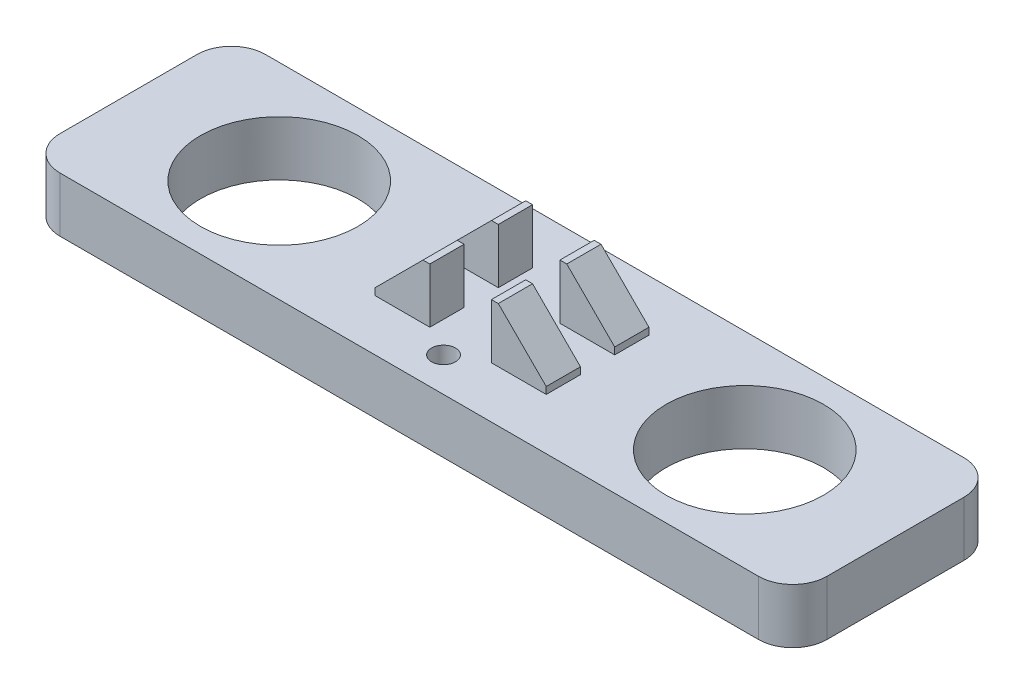
ISO-10303-21;
HEADER;
FILE_DESCRIPTION(('STEP AP214'),'2;1');
FILE_NAME('part.step','',(''),(''),'','','');
FILE_SCHEMA(('AUTOMOTIVE_DESIGN { 1 0 10303 214 1 1 1 1 }'));
ENDSEC;
DATA;
#1=APPLICATION_CONTEXT('core data for automotive mechanical design processes');
#2=APPLICATION_PROTOCOL_DEFINITION('international standard','automotive_design',2000,#1);
#3=PRODUCT_CONTEXT('',#1,'mechanical');
#4=PRODUCT('Part','Part','',(#3));
#5=PRODUCT_RELATED_PRODUCT_CATEGORY('part','',(#4));
#6=PRODUCT_DEFINITION_FORMATION('','',#4);
#7=PRODUCT_DEFINITION_CONTEXT('part definition',#1,'design');
#8=PRODUCT_DEFINITION('design','',#6,#7);
#9=PRODUCT_DEFINITION_SHAPE('','',#8);
#10=(LENGTH_UNIT() NAMED_UNIT(*) SI_UNIT(.MILLI.,.METRE.));
#11=(NAMED_UNIT(*) PLANE_ANGLE_UNIT() SI_UNIT($,.RADIAN.));
#12=(NAMED_UNIT(*) SI_UNIT($,.STERADIAN.) SOLID_ANGLE_UNIT());
#13=UNCERTAINTY_MEASURE_WITH_UNIT(LENGTH_MEASURE(1.E-05),#10,'distance_accuracy_value','');
#14=(GEOMETRIC_REPRESENTATION_CONTEXT(3) GLOBAL_UNCERTAINTY_ASSIGNED_CONTEXT((#13)) GLOBAL_UNIT_ASSIGNED_CONTEXT((#10,
#11,#12)) REPRESENTATION_CONTEXT('',''));
#15=CARTESIAN_POINT('',(0.,0.,0.));
#16=DIRECTION('',(0.,0.,1.));
#17=DIRECTION('',(1.,0.,0.));
#18=AXIS2_PLACEMENT_3D('',#15,#16,#17);
#19=CARTESIAN_POINT('',(0.,5.,0.));
#20=DIRECTION('',(0.,-1.,0.));
#21=DIRECTION('',(0.,0.,-1.));
#22=AXIS2_PLACEMENT_3D('',#19,#20,#21);
#23=PLANE('',#22);
#24=DIRECTION('',(-1.,0.,0.));
#25=VECTOR('',#24,1.);
#26=CARTESIAN_POINT('',(60.5,5.,-7.5));
#27=LINE('',#26,#25);
#28=CARTESIAN_POINT('',(68.5,5.,-7.5));
#29=VERTEX_POINT('',#28);
#30=CARTESIAN_POINT('',(60.5,5.,-7.5));
#31=VERTEX_POINT('',#30);
#32=EDGE_CURVE('E257',#29,#31,#27,.T.);
#33=ORIENTED_EDGE('',*,*,#32,.T.);
#34=DIRECTION('',(0.,0.,-1.));
#35=VECTOR('',#34,1.);
#36=CARTESIAN_POINT('',(60.5,5.,-7.5));
#37=LINE('',#36,#35);
#38=CARTESIAN_POINT('',(60.5,5.,-12.5));
#39=VERTEX_POINT('',#38);
#40=EDGE_CURVE('E241',#31,#39,#37,.T.);
#41=ORIENTED_EDGE('',*,*,#40,.T.);
#42=DIRECTION('',(1.,0.,0.));
#43=VECTOR('',#42,1.);
#44=CARTESIAN_POINT('',(60.5,5.,-12.5));
#45=LINE('',#44,#43);
#46=CARTESIAN_POINT('',(68.5,5.,-12.5));
#47=VERTEX_POINT('',#46);
#48=EDGE_CURVE('E248',#39,#47,#45,.T.);
#49=ORIENTED_EDGE('',*,*,#48,.T.);
#50=DIRECTION('',(0.,0.,1.));
#51=VECTOR('',#50,1.);
#52=CARTESIAN_POINT('',(68.5,5.,-7.5));
#53=LINE('',#52,#51);
#54=EDGE_CURVE('E251',#47,#29,#53,.T.);
#55=ORIENTED_EDGE('',*,*,#54,.T.);
#56=EDGE_LOOP('',(#33,#41,#49,#55));
#57=FACE_BOUND('',#56,.T.);
#58=DIRECTION('',(-1.,0.,0.));
#59=VECTOR('',#58,1.);
#60=CARTESIAN_POINT('',(43.5,5.,-7.5));
#61=LINE('',#60,#59);
#62=CARTESIAN_POINT('',(51.5,5.,-7.5));
#63=VERTEX_POINT('',#62);
#64=CARTESIAN_POINT('',(43.5,5.,-7.5));
#65=VERTEX_POINT('',#64);
#66=EDGE_CURVE('E276',#63,#65,#61,.T.);
#67=ORIENTED_EDGE('',*,*,#66,.T.);
#68=DIRECTION('',(0.,0.,-1.));
#69=VECTOR('',#68,1.);
#70=CARTESIAN_POINT('',(43.5,5.,-7.5));
#71=LINE('',#70,#69);
#72=CARTESIAN_POINT('',(43.5,5.,-12.5));
#73=VERTEX_POINT('',#72);
#74=EDGE_CURVE('E243',#65,#73,#71,.T.);
#75=ORIENTED_EDGE('',*,*,#74,.T.);
#76=DIRECTION('',(1.,0.,0.));
#77=VECTOR('',#76,1.);
#78=CARTESIAN_POINT('',(43.5,5.,-12.5));
#79=LINE('',#78,#77);
#80=CARTESIAN_POINT('',(51.5,5.,-12.5));
#81=VERTEX_POINT('',#80);
#82=EDGE_CURVE('E268',#73,#81,#79,.T.);
#83=ORIENTED_EDGE('',*,*,#82,.T.);
#84=DIRECTION('',(0.,0.,1.));
#85=VECTOR('',#84,1.);
#86=CARTESIAN_POINT('',(51.5,5.,-7.5));
#87=LINE('',#86,#85);
#88=EDGE_CURVE('E279',#81,#63,#87,.T.);
#89=ORIENTED_EDGE('',*,*,#88,.T.);
#90=EDGE_LOOP('',(#67,#75,#83,#89));
#91=FACE_BOUND('',#90,.T.);
#92=DIRECTION('',(0.,0.,1.));
#93=VECTOR('',#92,1.);
#94=CARTESIAN_POINT('',(43.5,5.,-22.5));
#95=LINE('',#94,#93);
#96=CARTESIAN_POINT('',(43.5,5.,-22.5));
#97=VERTEX_POINT('',#96);
#98=CARTESIAN_POINT('',(43.5,5.,-17.5));
#99=VERTEX_POINT('',#98);
#100=EDGE_CURVE('E322',#97,#99,#95,.T.);
#101=ORIENTED_EDGE('',*,*,#100,.F.);
#102=DIRECTION('',(-1.,0.,0.));
#103=VECTOR('',#102,1.);
#104=CARTESIAN_POINT('',(43.5,5.,-22.5));
#105=LINE('',#104,#103);
#106=CARTESIAN_POINT('',(51.5,5.,-22.5));
#107=VERTEX_POINT('',#106);
#108=EDGE_CURVE('E326',#107,#97,#105,.T.);
#109=ORIENTED_EDGE('',*,*,#108,.F.);
#110=DIRECTION('',(0.,0.,-1.));
#111=VECTOR('',#110,1.);
#112=CARTESIAN_POINT('',(51.5,5.,-22.5));
#113=LINE('',#112,#111);
#114=CARTESIAN_POINT('',(51.5,5.,-17.5));
#115=VERTEX_POINT('',#114);
#116=EDGE_CURVE('E337',#115,#107,#113,.T.);
#117=ORIENTED_EDGE('',*,*,#116,.F.);
#118=DIRECTION('',(1.,0.,0.));
#119=VECTOR('',#118,1.);
#120=CARTESIAN_POINT('',(43.5,5.,-17.5));
#121=LINE('',#120,#119);
#122=EDGE_CURVE('E334',#99,#115,#121,.T.);
#123=ORIENTED_EDGE('',*,*,#122,.F.);
#124=EDGE_LOOP('',(#101,#109,#117,#123));
#125=FACE_BOUND('',#124,.T.);
#126=CARTESIAN_POINT('',(56.,5.,-25.));
#127=DIRECTION('',(0.,-1.,0.));
#128=DIRECTION('',(0.,0.,1.));
#129=AXIS2_PLACEMENT_3D('',#126,#127,#128);
#130=CIRCLE('',#129,1.75);
#131=CARTESIAN_POINT('',(56.,5.,-23.25));
#132=VERTEX_POINT('',#131);
#133=EDGE_CURVE('E364',#132,#132,#130,.T.);
#134=ORIENTED_EDGE('',*,*,#133,.T.);
#135=EDGE_LOOP('',(#134));
#136=FACE_BOUND('',#135,.T.);
#137=CARTESIAN_POINT('',(56.,5.,-5.));
#138=DIRECTION('',(0.,-1.,0.));
#139=DIRECTION('',(0.,0.,1.));
#140=AXIS2_PLACEMENT_3D('',#137,#138,#139);
#141=CIRCLE('',#140,1.75);
#142=CARTESIAN_POINT('',(56.,5.,-3.25));
#143=VERTEX_POINT('',#142);
#144=EDGE_CURVE('E363',#143,#143,#141,.T.);
#145=ORIENTED_EDGE('',*,*,#144,.T.);
#146=EDGE_LOOP('',(#145));
#147=FACE_BOUND('',#146,.T.);
#148=DIRECTION('',(1.,0.,0.));
#149=VECTOR('',#148,1.);
#150=CARTESIAN_POINT('',(0.,5.,0.));
#151=LINE('',#150,#149);
#152=CARTESIAN_POINT('',(5.,5.,0.));
#153=VERTEX_POINT('',#152);
#154=CARTESIAN_POINT('',(107.,5.,0.));
#155=VERTEX_POINT('',#154);
#156=EDGE_CURVE('E403',#153,#155,#151,.T.);
#157=ORIENTED_EDGE('',*,*,#156,.T.);
#158=CARTESIAN_POINT('',(107.,5.,-5.));
#159=DIRECTION('',(0.,-1.,0.));
#160=DIRECTION('',(0.,0.,-1.));
#161=AXIS2_PLACEMENT_3D('',#158,#159,#160);
#162=CIRCLE('',#161,5.);
#163=CARTESIAN_POINT('',(112.,5.,-5.));
#164=VERTEX_POINT('',#163);
#165=EDGE_CURVE('E430',#155,#164,#162,.F.);
#166=ORIENTED_EDGE('',*,*,#165,.T.);
#167=DIRECTION('',(0.,0.,1.));
#168=VECTOR('',#167,1.);
#169=CARTESIAN_POINT('',(112.,5.,0.));
#170=LINE('',#169,#168);
#171=CARTESIAN_POINT('',(112.,5.,-25.));
#172=VERTEX_POINT('',#171);
#173=EDGE_CURVE('E372',#172,#164,#170,.T.);
#174=ORIENTED_EDGE('',*,*,#173,.F.);
#175=CARTESIAN_POINT('',(107.,5.,-25.));
#176=DIRECTION('',(0.,-1.,0.));
#177=DIRECTION('',(0.,0.,-1.));
#178=AXIS2_PLACEMENT_3D('',#175,#176,#177);
#179=CIRCLE('',#178,5.);
#180=CARTESIAN_POINT('',(107.,5.,-30.));
#181=VERTEX_POINT('',#180);
#182=EDGE_CURVE('E428',#172,#181,#179,.F.);
#183=ORIENTED_EDGE('',*,*,#182,.T.);
#184=DIRECTION('',(-1.,0.,0.));
#185=VECTOR('',#184,1.);
#186=CARTESIAN_POINT('',(0.,5.,-30.));
#187=LINE('',#186,#185);
#188=CARTESIAN_POINT('',(5.,5.,-30.));
#189=VERTEX_POINT('',#188);
#190=EDGE_CURVE('E406',#181,#189,#187,.T.);
#191=ORIENTED_EDGE('',*,*,#190,.T.);
#192=CARTESIAN_POINT('',(5.,5.,-25.));
#193=DIRECTION('',(0.,-1.,0.));
#194=DIRECTION('',(0.,0.,-1.));
#195=AXIS2_PLACEMENT_3D('',#192,#193,#194);
#196=CIRCLE('',#195,5.);
#197=CARTESIAN_POINT('',(0.,5.,-25.));
#198=VERTEX_POINT('',#197);
#199=EDGE_CURVE('E415',#189,#198,#196,.F.);
#200=ORIENTED_EDGE('',*,*,#199,.T.);
#201=DIRECTION('',(0.,0.,1.));
#202=VECTOR('',#201,1.);
#203=CARTESIAN_POINT('',(0.,5.,0.));
#204=LINE('',#203,#202);
#205=CARTESIAN_POINT('',(0.,5.,-5.));
#206=VERTEX_POINT('',#205);
#207=EDGE_CURVE('E400',#198,#206,#204,.T.);
#208=ORIENTED_EDGE('',*,*,#207,.T.);
#209=CARTESIAN_POINT('',(5.,5.,-5.));
#210=DIRECTION('',(0.,-1.,0.));
#211=DIRECTION('',(0.,0.,-1.));
#212=AXIS2_PLACEMENT_3D('',#209,#210,#211);
#213=CIRCLE('',#212,5.);
#214=EDGE_CURVE('E417',#206,#153,#213,.F.);
#215=ORIENTED_EDGE('',*,*,#214,.T.);
#216=EDGE_LOOP('',(#157,#166,#174,#183,#191,#200,#208,#215));
#217=FACE_BOUND('',#216,.T.);
#218=CARTESIAN_POINT('',(22.,5.,-15.));
#219=DIRECTION('',(0.,1.,0.));
#220=DIRECTION('',(0.,0.,1.));
#221=AXIS2_PLACEMENT_3D('',#218,#219,#220);
#222=CIRCLE('',#221,11.5);
#223=CARTESIAN_POINT('',(22.,5.,-3.5));
#224=VERTEX_POINT('',#223);
#225=EDGE_CURVE('E397',#224,#224,#222,.T.);
#226=ORIENTED_EDGE('',*,*,#225,.F.);
#227=EDGE_LOOP('',(#226));
#228=FACE_BOUND('',#227,.T.);
#229=CARTESIAN_POINT('',(90.,5.,-15.));
#230=DIRECTION('',(0.,-1.,0.));
#231=DIRECTION('',(0.,0.,1.));
#232=AXIS2_PLACEMENT_3D('',#229,#230,#231);
#233=CIRCLE('',#232,11.5);
#234=CARTESIAN_POINT('',(90.,5.,-3.5));
#235=VERTEX_POINT('',#234);
#236=EDGE_CURVE('E367',#235,#235,#233,.T.);
#237=ORIENTED_EDGE('',*,*,#236,.T.);
#238=EDGE_LOOP('',(#237));
#239=FACE_BOUND('',#238,.T.);
#240=DIRECTION('',(0.,0.,1.));
#241=VECTOR('',#240,1.);
#242=CARTESIAN_POINT('',(60.5,5.,-22.5));
#243=LINE('',#242,#241);
#244=CARTESIAN_POINT('',(60.5,5.,-22.5));
#245=VERTEX_POINT('',#244);
#246=CARTESIAN_POINT('',(60.5,5.,-17.5));
#247=VERTEX_POINT('',#246);
#248=EDGE_CURVE('E292',#245,#247,#243,.T.);
#249=ORIENTED_EDGE('',*,*,#248,.F.);
#250=DIRECTION('',(-1.,0.,0.));
#251=VECTOR('',#250,1.);
#252=CARTESIAN_POINT('',(60.5,5.,-22.5));
#253=LINE('',#252,#251);
#254=CARTESIAN_POINT('',(68.5,5.,-22.5));
#255=VERTEX_POINT('',#254);
#256=EDGE_CURVE('E297',#255,#245,#253,.T.);
#257=ORIENTED_EDGE('',*,*,#256,.F.);
#258=DIRECTION('',(0.,0.,-1.));
#259=VECTOR('',#258,1.);
#260=CARTESIAN_POINT('',(68.5,5.,-22.5));
#261=LINE('',#260,#259);
#262=CARTESIAN_POINT('',(68.5,5.,-17.5));
#263=VERTEX_POINT('',#262);
#264=EDGE_CURVE('E308',#263,#255,#261,.T.);
#265=ORIENTED_EDGE('',*,*,#264,.F.);
#266=DIRECTION('',(1.,0.,0.));
#267=VECTOR('',#266,1.);
#268=CARTESIAN_POINT('',(60.5,5.,-17.5));
#269=LINE('',#268,#267);
#270=EDGE_CURVE('E305',#247,#263,#269,.T.);
#271=ORIENTED_EDGE('',*,*,#270,.F.);
#272=EDGE_LOOP('',(#249,#257,#265,#271));
#273=FACE_BOUND('',#272,.T.);
#274=ADVANCED_FACE('F38',(#57,#91,#125,#136,#147,#217,#228,#239,#273),#23,.F.);
#275=CARTESIAN_POINT('',(0.,5.,0.));
#276=DIRECTION('',(1.,0.,0.));
#277=DIRECTION('',(0.,0.,-1.));
#278=AXIS2_PLACEMENT_3D('',#275,#276,#277);
#279=PLANE('',#278);
#280=DIRECTION('',(0.,-1.,0.));
#281=VECTOR('',#280,1.);
#282=CARTESIAN_POINT('',(0.,5.,-25.));
#283=LINE('',#282,#281);
#284=CARTESIAN_POINT('',(0.,-3.,-25.));
#285=VERTEX_POINT('',#284);
#286=EDGE_CURVE('E411',#198,#285,#283,.T.);
#287=ORIENTED_EDGE('',*,*,#286,.T.);
#288=DIRECTION('',(0.,0.,-1.));
#289=VECTOR('',#288,1.);
#290=CARTESIAN_POINT('',(0.,-3.,0.));
#291=LINE('',#290,#289);
#292=CARTESIAN_POINT('',(0.,-3.,-5.));
#293=VERTEX_POINT('',#292);
#294=EDGE_CURVE('E386',#293,#285,#291,.T.);
#295=ORIENTED_EDGE('',*,*,#294,.F.);
#296=DIRECTION('',(0.,-1.,0.));
#297=VECTOR('',#296,1.);
#298=CARTESIAN_POINT('',(0.,5.,-5.));
#299=LINE('',#298,#297);
#300=EDGE_CURVE('E413',#293,#206,#299,.F.);
#301=ORIENTED_EDGE('',*,*,#300,.T.);
#302=ORIENTED_EDGE('',*,*,#207,.F.);
#303=EDGE_LOOP('',(#287,#295,#301,#302));
#304=FACE_BOUND('',#303,.T.);
#305=ADVANCED_FACE('F486',(#304),#279,.F.);
#306=CARTESIAN_POINT('',(0.,5.,0.));
#307=DIRECTION('',(0.,0.,-1.));
#308=DIRECTION('',(-1.,0.,0.));
#309=AXIS2_PLACEMENT_3D('',#306,#307,#308);
#310=PLANE('',#309);
#311=DIRECTION('',(0.,-1.,0.));
#312=VECTOR('',#311,1.);
#313=CARTESIAN_POINT('',(5.,5.,0.));
#314=LINE('',#313,#312);
#315=CARTESIAN_POINT('',(5.,-3.,0.));
#316=VERTEX_POINT('',#315);
#317=EDGE_CURVE('E408',#153,#316,#314,.T.);
#318=ORIENTED_EDGE('',*,*,#317,.T.);
#319=DIRECTION('',(-1.,0.,0.));
#320=VECTOR('',#319,1.);
#321=CARTESIAN_POINT('',(0.,-3.,0.));
#322=LINE('',#321,#320);
#323=CARTESIAN_POINT('',(107.,-3.,0.));
#324=VERTEX_POINT('',#323);
#325=EDGE_CURVE('E381',#324,#316,#322,.T.);
#326=ORIENTED_EDGE('',*,*,#325,.F.);
#327=DIRECTION('',(0.,-1.,0.));
#328=VECTOR('',#327,1.);
#329=CARTESIAN_POINT('',(107.,5.,0.));
#330=LINE('',#329,#328);
#331=EDGE_CURVE('E426',#324,#155,#330,.F.);
#332=ORIENTED_EDGE('',*,*,#331,.T.);
#333=ORIENTED_EDGE('',*,*,#156,.F.);
#334=EDGE_LOOP('',(#318,#326,#332,#333));
#335=FACE_BOUND('',#334,.T.);
#336=ADVANCED_FACE('F492',(#335),#310,.F.);
#337=CARTESIAN_POINT('',(0.,5.,-30.));
#338=DIRECTION('',(0.,0.,1.));
#339=DIRECTION('',(1.,0.,0.));
#340=AXIS2_PLACEMENT_3D('',#337,#338,#339);
#341=PLANE('',#340);
#342=DIRECTION('',(0.,-1.,0.));
#343=VECTOR('',#342,1.);
#344=CARTESIAN_POINT('',(107.,0.,-30.));
#345=LINE('',#344,#343);
#346=CARTESIAN_POINT('',(107.,-3.,-30.));
#347=VERTEX_POINT('',#346);
#348=EDGE_CURVE('E432',#181,#347,#345,.T.);
#349=ORIENTED_EDGE('',*,*,#348,.T.);
#350=DIRECTION('',(1.,0.,0.));
#351=VECTOR('',#350,1.);
#352=CARTESIAN_POINT('',(0.,-3.,-30.));
#353=LINE('',#352,#351);
#354=CARTESIAN_POINT('',(5.,-3.,-30.));
#355=VERTEX_POINT('',#354);
#356=EDGE_CURVE('E392',#355,#347,#353,.T.);
#357=ORIENTED_EDGE('',*,*,#356,.F.);
#358=DIRECTION('',(0.,-1.,0.));
#359=VECTOR('',#358,1.);
#360=CARTESIAN_POINT('',(5.,5.,-30.));
#361=LINE('',#360,#359);
#362=EDGE_CURVE('E419',#355,#189,#361,.F.);
#363=ORIENTED_EDGE('',*,*,#362,.T.);
#364=ORIENTED_EDGE('',*,*,#190,.F.);
#365=EDGE_LOOP('',(#349,#357,#363,#364));
#366=FACE_BOUND('',#365,.T.);
#367=ADVANCED_FACE('F499',(#366),#341,.F.);
#368=CARTESIAN_POINT('',(22.,5.,-15.));
#369=DIRECTION('',(0.,-1.,0.));
#370=DIRECTION('',(0.,0.,-1.));
#371=AXIS2_PLACEMENT_3D('',#368,#369,#370);
#372=CYLINDRICAL_SURFACE('',#371,11.5);
#373=ORIENTED_EDGE('',*,*,#225,.T.);
#374=EDGE_LOOP('',(#373));
#375=FACE_BOUND('',#374,.T.);
#376=CARTESIAN_POINT('',(22.,-3.,-15.));
#377=DIRECTION('',(0.,-1.,0.));
#378=DIRECTION('',(0.,0.,-1.));
#379=AXIS2_PLACEMENT_3D('',#376,#377,#378);
#380=CIRCLE('',#379,11.5);
#381=CARTESIAN_POINT('',(22.,-3.,-26.5));
#382=VERTEX_POINT('',#381);
#383=EDGE_CURVE('E378',#382,#382,#380,.F.);
#384=ORIENTED_EDGE('',*,*,#383,.F.);
#385=EDGE_LOOP('',(#384));
#386=FACE_BOUND('',#385,.T.);
#387=ADVANCED_FACE('F497',(#375,#386),#372,.F.);
#388=CARTESIAN_POINT('',(56.,0.,-5.));
#389=DIRECTION('',(0.,1.,0.));
#390=DIRECTION('',(0.,0.,1.));
#391=AXIS2_PLACEMENT_3D('',#388,#389,#390);
#392=CYLINDRICAL_SURFACE('',#391,1.75);
#393=CARTESIAN_POINT('',(56.,-3.,-5.));
#394=DIRECTION('',(0.,-1.,0.));
#395=DIRECTION('',(0.,0.,-1.));
#396=AXIS2_PLACEMENT_3D('',#393,#394,#395);
#397=CIRCLE('',#396,1.75);
#398=CARTESIAN_POINT('',(56.,-3.,-6.75));
#399=VERTEX_POINT('',#398);
#400=EDGE_CURVE('E375',#399,#399,#397,.F.);
#401=ORIENTED_EDGE('',*,*,#400,.F.);
#402=EDGE_LOOP('',(#401));
#403=FACE_BOUND('',#402,.T.);
#404=ORIENTED_EDGE('',*,*,#144,.F.);
#405=EDGE_LOOP('',(#404));
#406=FACE_BOUND('',#405,.T.);
#407=ADVANCED_FACE('F592',(#403,#406),#392,.F.);
#408=CARTESIAN_POINT('',(56.,0.,-25.));
#409=DIRECTION('',(0.,1.,0.));
#410=DIRECTION('',(0.,0.,1.));
#411=AXIS2_PLACEMENT_3D('',#408,#409,#410);
#412=CYLINDRICAL_SURFACE('',#411,1.75);
#413=CARTESIAN_POINT('',(56.,-3.,-25.));
#414=DIRECTION('',(0.,-1.,0.));
#415=DIRECTION('',(0.,0.,-1.));
#416=AXIS2_PLACEMENT_3D('',#413,#414,#415);
#417=CIRCLE('',#416,1.75);
#418=CARTESIAN_POINT('',(56.,-3.,-26.75));
#419=VERTEX_POINT('',#418);
#420=EDGE_CURVE('E394',#419,#419,#417,.F.);
#421=ORIENTED_EDGE('',*,*,#420,.F.);
#422=EDGE_LOOP('',(#421));
#423=FACE_BOUND('',#422,.T.);
#424=ORIENTED_EDGE('',*,*,#133,.F.);
#425=EDGE_LOOP('',(#424));
#426=FACE_BOUND('',#425,.T.);
#427=ADVANCED_FACE('F510',(#423,#426),#412,.F.);
#428=CARTESIAN_POINT('',(5.,5.,-5.));
#429=DIRECTION('',(0.,-1.,0.));
#430=DIRECTION('',(0.,0.,-1.));
#431=AXIS2_PLACEMENT_3D('',#428,#429,#430);
#432=CYLINDRICAL_SURFACE('',#431,5.);
#433=ORIENTED_EDGE('',*,*,#214,.F.);
#434=ORIENTED_EDGE('',*,*,#300,.F.);
#435=CARTESIAN_POINT('',(5.,-3.,-5.));
#436=DIRECTION('',(0.,-1.,0.));
#437=DIRECTION('',(0.,0.,-1.));
#438=AXIS2_PLACEMENT_3D('',#435,#436,#437);
#439=CIRCLE('',#438,5.);
#440=EDGE_CURVE('E383',#316,#293,#439,.T.);
#441=ORIENTED_EDGE('',*,*,#440,.F.);
#442=ORIENTED_EDGE('',*,*,#317,.F.);
#443=EDGE_LOOP('',(#433,#434,#441,#442));
#444=FACE_BOUND('',#443,.T.);
#445=ADVANCED_FACE('F506',(#444),#432,.T.);
#446=CARTESIAN_POINT('',(5.,5.,-25.));
#447=DIRECTION('',(0.,-1.,0.));
#448=DIRECTION('',(0.,0.,-1.));
#449=AXIS2_PLACEMENT_3D('',#446,#447,#448);
#450=CYLINDRICAL_SURFACE('',#449,5.);
#451=ORIENTED_EDGE('',*,*,#199,.F.);
#452=ORIENTED_EDGE('',*,*,#362,.F.);
#453=CARTESIAN_POINT('',(5.,-3.,-25.));
#454=DIRECTION('',(0.,-1.,0.));
#455=DIRECTION('',(0.,0.,-1.));
#456=AXIS2_PLACEMENT_3D('',#453,#454,#455);
#457=CIRCLE('',#456,5.);
#458=EDGE_CURVE('E389',#285,#355,#457,.T.);
#459=ORIENTED_EDGE('',*,*,#458,.F.);
#460=ORIENTED_EDGE('',*,*,#286,.F.);
#461=EDGE_LOOP('',(#451,#452,#459,#460));
#462=FACE_BOUND('',#461,.T.);
#463=ADVANCED_FACE('F509',(#462),#450,.T.);
#464=CARTESIAN_POINT('',(0.,-3.,0.));
#465=DIRECTION('',(0.,-1.,0.));
#466=DIRECTION('',(0.,0.,-1.));
#467=AXIS2_PLACEMENT_3D('',#464,#465,#466);
#468=PLANE('',#467);
#469=ORIENTED_EDGE('',*,*,#356,.T.);
#470=CARTESIAN_POINT('',(107.,-3.,-25.));
#471=DIRECTION('',(0.,1.,0.));
#472=DIRECTION('',(0.,0.,-1.));
#473=AXIS2_PLACEMENT_3D('',#470,#471,#472);
#474=CIRCLE('',#473,5.);
#475=CARTESIAN_POINT('',(112.,-3.,-25.));
#476=VERTEX_POINT('',#475);
#477=EDGE_CURVE('E354',#476,#347,#474,.T.);
#478=ORIENTED_EDGE('',*,*,#477,.F.);
#479=DIRECTION('',(0.,0.,-1.));
#480=VECTOR('',#479,1.);
#481=CARTESIAN_POINT('',(112.,-3.,0.));
#482=LINE('',#481,#480);
#483=CARTESIAN_POINT('',(112.,-3.,-5.));
#484=VERTEX_POINT('',#483);
#485=EDGE_CURVE('E357',#484,#476,#482,.T.);
#486=ORIENTED_EDGE('',*,*,#485,.F.);
#487=CARTESIAN_POINT('',(107.,-3.,-5.));
#488=DIRECTION('',(0.,1.,0.));
#489=DIRECTION('',(0.,0.,-1.));
#490=AXIS2_PLACEMENT_3D('',#487,#488,#489);
#491=CIRCLE('',#490,5.);
#492=EDGE_CURVE('E360',#324,#484,#491,.T.);
#493=ORIENTED_EDGE('',*,*,#492,.F.);
#494=ORIENTED_EDGE('',*,*,#325,.T.);
#495=ORIENTED_EDGE('',*,*,#440,.T.);
#496=ORIENTED_EDGE('',*,*,#294,.T.);
#497=ORIENTED_EDGE('',*,*,#458,.T.);
#498=EDGE_LOOP('',(#469,#478,#486,#493,#494,#495,#496,#497));
#499=FACE_BOUND('',#498,.T.);
#500=ORIENTED_EDGE('',*,*,#383,.T.);
#501=EDGE_LOOP('',(#500));
#502=FACE_BOUND('',#501,.T.);
#503=ORIENTED_EDGE('',*,*,#420,.T.);
#504=EDGE_LOOP('',(#503));
#505=FACE_BOUND('',#504,.T.);
#506=ORIENTED_EDGE('',*,*,#400,.T.);
#507=EDGE_LOOP('',(#506));
#508=FACE_BOUND('',#507,.T.);
#509=CARTESIAN_POINT('',(90.,-3.,-15.));
#510=DIRECTION('',(0.,1.,0.));
#511=DIRECTION('',(0.,0.,-1.));
#512=AXIS2_PLACEMENT_3D('',#509,#510,#511);
#513=CIRCLE('',#512,11.5);
#514=CARTESIAN_POINT('',(90.,-3.,-26.5));
#515=VERTEX_POINT('',#514);
#516=EDGE_CURVE('E351',#515,#515,#513,.F.);
#517=ORIENTED_EDGE('',*,*,#516,.F.);
#518=EDGE_LOOP('',(#517));
#519=FACE_BOUND('',#518,.T.);
#520=ADVANCED_FACE('F514',(#499,#502,#505,#508,#519),#468,.T.);
#521=CARTESIAN_POINT('',(112.,5.,0.));
#522=DIRECTION('',(1.,0.,0.));
#523=DIRECTION('',(0.,0.,-1.));
#524=AXIS2_PLACEMENT_3D('',#521,#522,#523);
#525=PLANE('',#524);
#526=ORIENTED_EDGE('',*,*,#173,.T.);
#527=DIRECTION('',(0.,-1.,0.));
#528=VECTOR('',#527,1.);
#529=CARTESIAN_POINT('',(112.,0.,-5.));
#530=LINE('',#529,#528);
#531=EDGE_CURVE('E424',#164,#484,#530,.T.);
#532=ORIENTED_EDGE('',*,*,#531,.T.);
#533=ORIENTED_EDGE('',*,*,#485,.T.);
#534=DIRECTION('',(0.,-1.,0.));
#535=VECTOR('',#534,1.);
#536=CARTESIAN_POINT('',(112.,5.,-25.));
#537=LINE('',#536,#535);
#538=EDGE_CURVE('E422',#476,#172,#537,.F.);
#539=ORIENTED_EDGE('',*,*,#538,.T.);
#540=EDGE_LOOP('',(#526,#532,#533,#539));
#541=FACE_BOUND('',#540,.T.);
#542=ADVANCED_FACE('F583',(#541),#525,.T.);
#543=CARTESIAN_POINT('',(90.,5.,-15.));
#544=DIRECTION('',(0.,-1.,0.));
#545=DIRECTION('',(0.,0.,-1.));
#546=AXIS2_PLACEMENT_3D('',#543,#544,#545);
#547=CYLINDRICAL_SURFACE('',#546,11.5);
#548=ORIENTED_EDGE('',*,*,#236,.F.);
#549=EDGE_LOOP('',(#548));
#550=FACE_BOUND('',#549,.T.);
#551=ORIENTED_EDGE('',*,*,#516,.T.);
#552=EDGE_LOOP('',(#551));
#553=FACE_BOUND('',#552,.T.);
#554=ADVANCED_FACE('F520',(#550,#553),#547,.F.);
#555=CARTESIAN_POINT('',(107.,5.,-5.));
#556=DIRECTION('',(0.,1.,0.));
#557=DIRECTION('',(0.,0.,1.));
#558=AXIS2_PLACEMENT_3D('',#555,#556,#557);
#559=CYLINDRICAL_SURFACE('',#558,5.);
#560=ORIENTED_EDGE('',*,*,#165,.F.);
#561=ORIENTED_EDGE('',*,*,#331,.F.);
#562=ORIENTED_EDGE('',*,*,#492,.T.);
#563=ORIENTED_EDGE('',*,*,#531,.F.);
#564=EDGE_LOOP('',(#560,#561,#562,#563));
#565=FACE_BOUND('',#564,.T.);
#566=ADVANCED_FACE('F516',(#565),#559,.T.);
#567=CARTESIAN_POINT('',(107.,5.,-25.));
#568=DIRECTION('',(0.,1.,0.));
#569=DIRECTION('',(0.,0.,1.));
#570=AXIS2_PLACEMENT_3D('',#567,#568,#569);
#571=CYLINDRICAL_SURFACE('',#570,5.);
#572=ORIENTED_EDGE('',*,*,#182,.F.);
#573=ORIENTED_EDGE('',*,*,#538,.F.);
#574=ORIENTED_EDGE('',*,*,#477,.T.);
#575=ORIENTED_EDGE('',*,*,#348,.F.);
#576=EDGE_LOOP('',(#572,#573,#574,#575));
#577=FACE_BOUND('',#576,.T.);
#578=ADVANCED_FACE('F519',(#577),#571,.T.);
#579=CARTESIAN_POINT('',(43.5,13.,-22.5));
#580=DIRECTION('',(1.,0.,0.));
#581=DIRECTION('',(0.,0.,-1.));
#582=AXIS2_PLACEMENT_3D('',#579,#580,#581);
#583=PLANE('',#582);
#584=DIRECTION('',(0.,-1.,0.));
#585=VECTOR('',#584,1.);
#586=CARTESIAN_POINT('',(43.5,13.,-17.5));
#587=LINE('',#586,#585);
#588=CARTESIAN_POINT('',(43.5,5.99999999999999,-17.5));
#589=VERTEX_POINT('',#588);
#590=EDGE_CURVE('E349',#589,#99,#587,.T.);
#591=ORIENTED_EDGE('',*,*,#590,.F.);
#592=DIRECTION('',(0.,0.,-1.));
#593=VECTOR('',#592,1.);
#594=CARTESIAN_POINT('',(43.5,5.99999999999999,-22.5));
#595=LINE('',#594,#593);
#596=CARTESIAN_POINT('',(43.5,5.99999999999999,-22.5));
#597=VERTEX_POINT('',#596);
#598=EDGE_CURVE('E449',#589,#597,#595,.T.);
#599=ORIENTED_EDGE('',*,*,#598,.T.);
#600=DIRECTION('',(0.,-1.,0.));
#601=VECTOR('',#600,1.);
#602=CARTESIAN_POINT('',(43.5,13.,-22.5));
#603=LINE('',#602,#601);
#604=EDGE_CURVE('E331',#597,#97,#603,.T.);
#605=ORIENTED_EDGE('',*,*,#604,.T.);
#606=ORIENTED_EDGE('',*,*,#100,.T.);
#607=EDGE_LOOP('',(#591,#599,#605,#606));
#608=FACE_BOUND('',#607,.T.);
#609=ADVANCED_FACE('F524',(#608),#583,.F.);
#610=CARTESIAN_POINT('',(43.5,13.,-17.5));
#611=DIRECTION('',(0.,0.,-1.));
#612=DIRECTION('',(-1.,0.,0.));
#613=AXIS2_PLACEMENT_3D('',#610,#611,#612);
#614=PLANE('',#613);
#615=DIRECTION('',(1.,0.,0.));
#616=VECTOR('',#615,1.);
#617=CARTESIAN_POINT('',(43.5,13.,-17.5));
#618=LINE('',#617,#616);
#619=CARTESIAN_POINT('',(50.5,13.,-17.5));
#620=VERTEX_POINT('',#619);
#621=CARTESIAN_POINT('',(51.5,13.,-17.5));
#622=VERTEX_POINT('',#621);
#623=EDGE_CURVE('E323',#620,#622,#618,.T.);
#624=ORIENTED_EDGE('',*,*,#623,.F.);
#625=DIRECTION('',(-0.707106781186546,-0.707106781186549,0.));
#626=VECTOR('',#625,1.);
#627=CARTESIAN_POINT('',(50.5,13.,-17.5));
#628=LINE('',#627,#626);
#629=EDGE_CURVE('E447',#620,#589,#628,.T.);
#630=ORIENTED_EDGE('',*,*,#629,.T.);
#631=ORIENTED_EDGE('',*,*,#590,.T.);
#632=ORIENTED_EDGE('',*,*,#122,.T.);
#633=DIRECTION('',(0.,-1.,0.));
#634=VECTOR('',#633,1.);
#635=CARTESIAN_POINT('',(51.5,13.,-17.5));
#636=LINE('',#635,#634);
#637=EDGE_CURVE('E346',#622,#115,#636,.T.);
#638=ORIENTED_EDGE('',*,*,#637,.F.);
#639=EDGE_LOOP('',(#624,#630,#631,#632,#638));
#640=FACE_BOUND('',#639,.T.);
#641=ADVANCED_FACE('F570',(#640),#614,.F.);
#642=CARTESIAN_POINT('',(51.5,13.,-22.5));
#643=DIRECTION('',(-1.,0.,0.));
#644=DIRECTION('',(0.,0.,1.));
#645=AXIS2_PLACEMENT_3D('',#642,#643,#644);
#646=PLANE('',#645);
#647=ORIENTED_EDGE('',*,*,#116,.T.);
#648=DIRECTION('',(0.,-1.,0.));
#649=VECTOR('',#648,1.);
#650=CARTESIAN_POINT('',(51.5,13.,-22.5));
#651=LINE('',#650,#649);
#652=CARTESIAN_POINT('',(51.5,13.,-22.5));
#653=VERTEX_POINT('',#652);
#654=EDGE_CURVE('E343',#653,#107,#651,.T.);
#655=ORIENTED_EDGE('',*,*,#654,.F.);
#656=DIRECTION('',(0.,0.,-1.));
#657=VECTOR('',#656,1.);
#658=CARTESIAN_POINT('',(51.5,13.,-22.5));
#659=LINE('',#658,#657);
#660=EDGE_CURVE('E325',#622,#653,#659,.T.);
#661=ORIENTED_EDGE('',*,*,#660,.F.);
#662=ORIENTED_EDGE('',*,*,#637,.T.);
#663=EDGE_LOOP('',(#647,#655,#661,#662));
#664=FACE_BOUND('',#663,.T.);
#665=ADVANCED_FACE('F563',(#664),#646,.F.);
#666=CARTESIAN_POINT('',(43.5,13.,-22.5));
#667=DIRECTION('',(0.,0.,1.));
#668=DIRECTION('',(1.,0.,0.));
#669=AXIS2_PLACEMENT_3D('',#666,#667,#668);
#670=PLANE('',#669);
#671=ORIENTED_EDGE('',*,*,#604,.F.);
#672=DIRECTION('',(0.707106781186546,0.707106781186549,0.));
#673=VECTOR('',#672,1.);
#674=CARTESIAN_POINT('',(50.5,13.,-22.5));
#675=LINE('',#674,#673);
#676=CARTESIAN_POINT('',(50.5,13.,-22.5));
#677=VERTEX_POINT('',#676);
#678=EDGE_CURVE('E451',#597,#677,#675,.T.);
#679=ORIENTED_EDGE('',*,*,#678,.T.);
#680=DIRECTION('',(-1.,0.,0.));
#681=VECTOR('',#680,1.);
#682=CARTESIAN_POINT('',(43.5,13.,-22.5));
#683=LINE('',#682,#681);
#684=EDGE_CURVE('E328',#653,#677,#683,.T.);
#685=ORIENTED_EDGE('',*,*,#684,.F.);
#686=ORIENTED_EDGE('',*,*,#654,.T.);
#687=ORIENTED_EDGE('',*,*,#108,.T.);
#688=EDGE_LOOP('',(#671,#679,#685,#686,#687));
#689=FACE_BOUND('',#688,.T.);
#690=ADVANCED_FACE('F555',(#689),#670,.F.);
#691=CARTESIAN_POINT('',(0.,13.,0.));
#692=DIRECTION('',(0.,1.,0.));
#693=DIRECTION('',(0.,0.,1.));
#694=AXIS2_PLACEMENT_3D('',#691,#692,#693);
#695=PLANE('',#694);
#696=ORIENTED_EDGE('',*,*,#684,.T.);
#697=DIRECTION('',(0.,0.,1.));
#698=VECTOR('',#697,1.);
#699=CARTESIAN_POINT('',(50.5,13.,-17.5));
#700=LINE('',#699,#698);
#701=EDGE_CURVE('E444',#677,#620,#700,.T.);
#702=ORIENTED_EDGE('',*,*,#701,.T.);
#703=ORIENTED_EDGE('',*,*,#623,.T.);
#704=ORIENTED_EDGE('',*,*,#660,.T.);
#705=EDGE_LOOP('',(#696,#702,#703,#704));
#706=FACE_BOUND('',#705,.T.);
#707=ADVANCED_FACE('F557',(#706),#695,.T.);
#708=CARTESIAN_POINT('',(60.5,13.,-22.5));
#709=DIRECTION('',(1.,0.,0.));
#710=DIRECTION('',(0.,0.,-1.));
#711=AXIS2_PLACEMENT_3D('',#708,#709,#710);
#712=PLANE('',#711);
#713=ORIENTED_EDGE('',*,*,#248,.T.);
#714=DIRECTION('',(0.,-1.,0.));
#715=VECTOR('',#714,1.);
#716=CARTESIAN_POINT('',(60.5,13.,-17.5));
#717=LINE('',#716,#715);
#718=CARTESIAN_POINT('',(60.5,13.,-17.5));
#719=VERTEX_POINT('',#718);
#720=EDGE_CURVE('E319',#719,#247,#717,.T.);
#721=ORIENTED_EDGE('',*,*,#720,.F.);
#722=DIRECTION('',(0.,0.,1.));
#723=VECTOR('',#722,1.);
#724=CARTESIAN_POINT('',(60.5,13.,-22.5));
#725=LINE('',#724,#723);
#726=CARTESIAN_POINT('',(60.5,13.,-22.5));
#727=VERTEX_POINT('',#726);
#728=EDGE_CURVE('E293',#727,#719,#725,.T.);
#729=ORIENTED_EDGE('',*,*,#728,.F.);
#730=DIRECTION('',(0.,-1.,0.));
#731=VECTOR('',#730,1.);
#732=CARTESIAN_POINT('',(60.5,13.,-22.5));
#733=LINE('',#732,#731);
#734=EDGE_CURVE('E302',#727,#245,#733,.T.);
#735=ORIENTED_EDGE('',*,*,#734,.T.);
#736=EDGE_LOOP('',(#713,#721,#729,#735));
#737=FACE_BOUND('',#736,.T.);
#738=ADVANCED_FACE('F622',(#737),#712,.F.);
#739=CARTESIAN_POINT('',(60.5,13.,-17.5));
#740=DIRECTION('',(0.,0.,-1.));
#741=DIRECTION('',(-1.,0.,0.));
#742=AXIS2_PLACEMENT_3D('',#739,#740,#741);
#743=PLANE('',#742);
#744=DIRECTION('',(0.,-1.,0.));
#745=VECTOR('',#744,1.);
#746=CARTESIAN_POINT('',(68.5,13.,-17.5));
#747=LINE('',#746,#745);
#748=CARTESIAN_POINT('',(68.5,5.99999999999999,-17.5));
#749=VERTEX_POINT('',#748);
#750=EDGE_CURVE('E317',#749,#263,#747,.T.);
#751=ORIENTED_EDGE('',*,*,#750,.F.);
#752=DIRECTION('',(-0.707106781186546,0.707106781186549,0.));
#753=VECTOR('',#752,1.);
#754=CARTESIAN_POINT('',(61.5,13.,-17.5));
#755=LINE('',#754,#753);
#756=CARTESIAN_POINT('',(61.5,13.,-17.5));
#757=VERTEX_POINT('',#756);
#758=EDGE_CURVE('E442',#749,#757,#755,.T.);
#759=ORIENTED_EDGE('',*,*,#758,.T.);
#760=DIRECTION('',(1.,0.,0.));
#761=VECTOR('',#760,1.);
#762=CARTESIAN_POINT('',(60.5,13.,-17.5));
#763=LINE('',#762,#761);
#764=EDGE_CURVE('E296',#719,#757,#763,.T.);
#765=ORIENTED_EDGE('',*,*,#764,.F.);
#766=ORIENTED_EDGE('',*,*,#720,.T.);
#767=ORIENTED_EDGE('',*,*,#270,.T.);
#768=EDGE_LOOP('',(#751,#759,#765,#766,#767));
#769=FACE_BOUND('',#768,.T.);
#770=ADVANCED_FACE('F631',(#769),#743,.F.);
#771=CARTESIAN_POINT('',(68.5,13.,-22.5));
#772=DIRECTION('',(-1.,0.,0.));
#773=DIRECTION('',(0.,0.,1.));
#774=AXIS2_PLACEMENT_3D('',#771,#772,#773);
#775=PLANE('',#774);
#776=DIRECTION('',(0.,-1.,0.));
#777=VECTOR('',#776,1.);
#778=CARTESIAN_POINT('',(68.5,13.,-22.5));
#779=LINE('',#778,#777);
#780=CARTESIAN_POINT('',(68.5,5.99999999999999,-22.5));
#781=VERTEX_POINT('',#780);
#782=EDGE_CURVE('E315',#781,#255,#779,.T.);
#783=ORIENTED_EDGE('',*,*,#782,.F.);
#784=DIRECTION('',(0.,0.,1.));
#785=VECTOR('',#784,1.);
#786=CARTESIAN_POINT('',(68.5,5.99999999999999,-17.5));
#787=LINE('',#786,#785);
#788=EDGE_CURVE('E440',#781,#749,#787,.T.);
#789=ORIENTED_EDGE('',*,*,#788,.T.);
#790=ORIENTED_EDGE('',*,*,#750,.T.);
#791=ORIENTED_EDGE('',*,*,#264,.T.);
#792=EDGE_LOOP('',(#783,#789,#790,#791));
#793=FACE_BOUND('',#792,.T.);
#794=ADVANCED_FACE('F627',(#793),#775,.F.);
#795=CARTESIAN_POINT('',(60.5,13.,-22.5));
#796=DIRECTION('',(0.,0.,1.));
#797=DIRECTION('',(1.,0.,0.));
#798=AXIS2_PLACEMENT_3D('',#795,#796,#797);
#799=PLANE('',#798);
#800=DIRECTION('',(-1.,0.,0.));
#801=VECTOR('',#800,1.);
#802=CARTESIAN_POINT('',(60.5,13.,-22.5));
#803=LINE('',#802,#801);
#804=CARTESIAN_POINT('',(61.5,13.,-22.5));
#805=VERTEX_POINT('',#804);
#806=EDGE_CURVE('E300',#805,#727,#803,.T.);
#807=ORIENTED_EDGE('',*,*,#806,.F.);
#808=DIRECTION('',(0.707106781186546,-0.707106781186549,0.));
#809=VECTOR('',#808,1.);
#810=CARTESIAN_POINT('',(61.5,13.,-22.5));
#811=LINE('',#810,#809);
#812=EDGE_CURVE('E438',#805,#781,#811,.T.);
#813=ORIENTED_EDGE('',*,*,#812,.T.);
#814=ORIENTED_EDGE('',*,*,#782,.T.);
#815=ORIENTED_EDGE('',*,*,#256,.T.);
#816=ORIENTED_EDGE('',*,*,#734,.F.);
#817=EDGE_LOOP('',(#807,#813,#814,#815,#816));
#818=FACE_BOUND('',#817,.T.);
#819=ADVANCED_FACE('F619',(#818),#799,.F.);
#820=CARTESIAN_POINT('',(0.,13.,0.));
#821=DIRECTION('',(0.,1.,0.));
#822=DIRECTION('',(0.,0.,1.));
#823=AXIS2_PLACEMENT_3D('',#820,#821,#822);
#824=PLANE('',#823);
#825=ORIENTED_EDGE('',*,*,#764,.T.);
#826=DIRECTION('',(0.,0.,-1.));
#827=VECTOR('',#826,1.);
#828=CARTESIAN_POINT('',(61.5,13.,-22.5));
#829=LINE('',#828,#827);
#830=EDGE_CURVE('E435',#757,#805,#829,.T.);
#831=ORIENTED_EDGE('',*,*,#830,.T.);
#832=ORIENTED_EDGE('',*,*,#806,.T.);
#833=ORIENTED_EDGE('',*,*,#728,.T.);
#834=EDGE_LOOP('',(#825,#831,#832,#833));
#835=FACE_BOUND('',#834,.T.);
#836=ADVANCED_FACE('F534',(#835),#824,.T.);
#837=CARTESIAN_POINT('',(61.5,13.,0.));
#838=DIRECTION('',(0.707106781186549,0.707106781186546,0.));
#839=DIRECTION('',(0.,0.,1.));
#840=AXIS2_PLACEMENT_3D('',#837,#838,#839);
#841=PLANE('',#840);
#842=ORIENTED_EDGE('',*,*,#758,.F.);
#843=ORIENTED_EDGE('',*,*,#788,.F.);
#844=ORIENTED_EDGE('',*,*,#812,.F.);
#845=ORIENTED_EDGE('',*,*,#830,.F.);
#846=EDGE_LOOP('',(#842,#843,#844,#845));
#847=FACE_BOUND('',#846,.T.);
#848=ADVANCED_FACE('F527',(#847),#841,.T.);
#849=CARTESIAN_POINT('',(50.5,13.,0.));
#850=DIRECTION('',(-0.707106781186549,0.707106781186546,0.));
#851=DIRECTION('',(0.,0.,-1.));
#852=AXIS2_PLACEMENT_3D('',#849,#850,#851);
#853=PLANE('',#852);
#854=ORIENTED_EDGE('',*,*,#678,.F.);
#855=ORIENTED_EDGE('',*,*,#598,.F.);
#856=ORIENTED_EDGE('',*,*,#629,.F.);
#857=ORIENTED_EDGE('',*,*,#701,.F.);
#858=EDGE_LOOP('',(#854,#855,#856,#857));
#859=FACE_BOUND('',#858,.T.);
#860=ADVANCED_FACE('F533',(#859),#853,.T.);
#861=CARTESIAN_POINT('',(43.5,13.,-7.5));
#862=DIRECTION('',(-1.,0.,0.));
#863=DIRECTION('',(0.,0.,1.));
#864=AXIS2_PLACEMENT_3D('',#861,#862,#863);
#865=PLANE('',#864);
#866=DIRECTION('',(0.,-1.,0.));
#867=VECTOR('',#866,1.);
#868=CARTESIAN_POINT('',(43.5,13.,-7.5));
#869=LINE('',#868,#867);
#870=CARTESIAN_POINT('',(43.5,5.99999999999999,-7.5));
#871=VERTEX_POINT('',#870);
#872=EDGE_CURVE('E290',#871,#65,#869,.T.);
#873=ORIENTED_EDGE('',*,*,#872,.F.);
#874=DIRECTION('',(0.,0.,-1.));
#875=VECTOR('',#874,1.);
#876=CARTESIAN_POINT('',(43.5,5.99999999999999,-7.5));
#877=LINE('',#876,#875);
#878=CARTESIAN_POINT('',(43.5,5.99999999999999,-12.5));
#879=VERTEX_POINT('',#878);
#880=EDGE_CURVE('E461',#871,#879,#877,.T.);
#881=ORIENTED_EDGE('',*,*,#880,.T.);
#882=DIRECTION('',(0.,-1.,0.));
#883=VECTOR('',#882,1.);
#884=CARTESIAN_POINT('',(43.5,13.,-12.5));
#885=LINE('',#884,#883);
#886=EDGE_CURVE('E273',#879,#73,#885,.T.);
#887=ORIENTED_EDGE('',*,*,#886,.T.);
#888=ORIENTED_EDGE('',*,*,#74,.F.);
#889=EDGE_LOOP('',(#873,#881,#887,#888));
#890=FACE_BOUND('',#889,.T.);
#891=ADVANCED_FACE('F467',(#890),#865,.T.);
#892=CARTESIAN_POINT('',(43.5,13.,-7.5));
#893=DIRECTION('',(0.,0.,1.));
#894=DIRECTION('',(1.,0.,0.));
#895=AXIS2_PLACEMENT_3D('',#892,#893,#894);
#896=PLANE('',#895);
#897=DIRECTION('',(-1.,0.,0.));
#898=VECTOR('',#897,1.);
#899=CARTESIAN_POINT('',(43.5,13.,-7.5));
#900=LINE('',#899,#898);
#901=CARTESIAN_POINT('',(51.5,13.,-7.5));
#902=VERTEX_POINT('',#901);
#903=CARTESIAN_POINT('',(50.5,13.,-7.5));
#904=VERTEX_POINT('',#903);
#905=EDGE_CURVE('E265',#902,#904,#900,.T.);
#906=ORIENTED_EDGE('',*,*,#905,.T.);
#907=DIRECTION('',(0.707106781186546,0.707106781186549,0.));
#908=VECTOR('',#907,1.);
#909=CARTESIAN_POINT('',(47.,9.50000000000001,-7.5));
#910=LINE('',#909,#908);
#911=EDGE_CURVE('E11',#904,#871,#910,.F.);
#912=ORIENTED_EDGE('',*,*,#911,.T.);
#913=ORIENTED_EDGE('',*,*,#872,.T.);
#914=ORIENTED_EDGE('',*,*,#66,.F.);
#915=DIRECTION('',(0.,-1.,0.));
#916=VECTOR('',#915,1.);
#917=CARTESIAN_POINT('',(51.5,13.,-7.5));
#918=LINE('',#917,#916);
#919=EDGE_CURVE('E288',#902,#63,#918,.T.);
#920=ORIENTED_EDGE('',*,*,#919,.F.);
#921=EDGE_LOOP('',(#906,#912,#913,#914,#920));
#922=FACE_BOUND('',#921,.T.);
#923=ADVANCED_FACE('F478',(#922),#896,.T.);
#924=CARTESIAN_POINT('',(51.5,13.,-7.5));
#925=DIRECTION('',(1.,0.,0.));
#926=DIRECTION('',(0.,0.,-1.));
#927=AXIS2_PLACEMENT_3D('',#924,#925,#926);
#928=PLANE('',#927);
#929=ORIENTED_EDGE('',*,*,#88,.F.);
#930=DIRECTION('',(0.,-1.,0.));
#931=VECTOR('',#930,1.);
#932=CARTESIAN_POINT('',(51.5,13.,-12.5));
#933=LINE('',#932,#931);
#934=CARTESIAN_POINT('',(51.5,13.,-12.5));
#935=VERTEX_POINT('',#934);
#936=EDGE_CURVE('E285',#935,#81,#933,.T.);
#937=ORIENTED_EDGE('',*,*,#936,.F.);
#938=DIRECTION('',(0.,0.,1.));
#939=VECTOR('',#938,1.);
#940=CARTESIAN_POINT('',(51.5,13.,-7.5));
#941=LINE('',#940,#939);
#942=EDGE_CURVE('E267',#935,#902,#941,.T.);
#943=ORIENTED_EDGE('',*,*,#942,.T.);
#944=ORIENTED_EDGE('',*,*,#919,.T.);
#945=EDGE_LOOP('',(#929,#937,#943,#944));
#946=FACE_BOUND('',#945,.T.);
#947=ADVANCED_FACE('F849',(#946),#928,.T.);
#948=CARTESIAN_POINT('',(43.5,13.,-12.5));
#949=DIRECTION('',(0.,0.,-1.));
#950=DIRECTION('',(-1.,0.,0.));
#951=AXIS2_PLACEMENT_3D('',#948,#949,#950);
#952=PLANE('',#951);
#953=ORIENTED_EDGE('',*,*,#886,.F.);
#954=DIRECTION('',(-0.707106781186546,-0.707106781186549,0.));
#955=VECTOR('',#954,1.);
#956=CARTESIAN_POINT('',(47.,9.50000000000001,-12.5));
#957=LINE('',#956,#955);
#958=CARTESIAN_POINT('',(50.5,13.,-12.5));
#959=VERTEX_POINT('',#958);
#960=EDGE_CURVE('E61',#879,#959,#957,.F.);
#961=ORIENTED_EDGE('',*,*,#960,.T.);
#962=DIRECTION('',(1.,0.,0.));
#963=VECTOR('',#962,1.);
#964=CARTESIAN_POINT('',(43.5,13.,-12.5));
#965=LINE('',#964,#963);
#966=EDGE_CURVE('E271',#959,#935,#965,.T.);
#967=ORIENTED_EDGE('',*,*,#966,.T.);
#968=ORIENTED_EDGE('',*,*,#936,.T.);
#969=ORIENTED_EDGE('',*,*,#82,.F.);
#970=EDGE_LOOP('',(#953,#961,#967,#968,#969));
#971=FACE_BOUND('',#970,.T.);
#972=ADVANCED_FACE('F472',(#971),#952,.T.);
#973=CARTESIAN_POINT('',(0.,13.,-30.));
#974=DIRECTION('',(0.,1.,0.));
#975=DIRECTION('',(0.,0.,-1.));
#976=AXIS2_PLACEMENT_3D('',#973,#974,#975);
#977=PLANE('',#976);
#978=ORIENTED_EDGE('',*,*,#966,.F.);
#979=DIRECTION('',(0.,0.,1.));
#980=VECTOR('',#979,1.);
#981=CARTESIAN_POINT('',(50.5,13.,-30.));
#982=LINE('',#981,#980);
#983=EDGE_CURVE('E47',#959,#904,#982,.T.);
#984=ORIENTED_EDGE('',*,*,#983,.T.);
#985=ORIENTED_EDGE('',*,*,#905,.F.);
#986=ORIENTED_EDGE('',*,*,#942,.F.);
#987=EDGE_LOOP('',(#978,#984,#985,#986));
#988=FACE_BOUND('',#987,.T.);
#989=ADVANCED_FACE('F867',(#988),#977,.T.);
#990=CARTESIAN_POINT('',(60.5,13.,-7.5));
#991=DIRECTION('',(-1.,0.,0.));
#992=DIRECTION('',(0.,0.,1.));
#993=AXIS2_PLACEMENT_3D('',#990,#991,#992);
#994=PLANE('',#993);
#995=ORIENTED_EDGE('',*,*,#40,.F.);
#996=DIRECTION('',(0.,-1.,0.));
#997=VECTOR('',#996,1.);
#998=CARTESIAN_POINT('',(60.5,13.,-7.5));
#999=LINE('',#998,#997);
#1000=CARTESIAN_POINT('',(60.5,13.,-7.5));
#1001=VERTEX_POINT('',#1000);
#1002=EDGE_CURVE('E227',#1001,#31,#999,.T.);
#1003=ORIENTED_EDGE('',*,*,#1002,.F.);
#1004=DIRECTION('',(0.,0.,-1.));
#1005=VECTOR('',#1004,1.);
#1006=CARTESIAN_POINT('',(60.5,13.,-7.5));
#1007=LINE('',#1006,#1005);
#1008=CARTESIAN_POINT('',(60.5,13.,-12.5));
#1009=VERTEX_POINT('',#1008);
#1010=EDGE_CURVE('E234',#1001,#1009,#1007,.T.);
#1011=ORIENTED_EDGE('',*,*,#1010,.T.);
#1012=DIRECTION('',(0.,-1.,0.));
#1013=VECTOR('',#1012,1.);
#1014=CARTESIAN_POINT('',(60.5,13.,-12.5));
#1015=LINE('',#1014,#1013);
#1016=EDGE_CURVE('E255',#1009,#39,#1015,.T.);
#1017=ORIENTED_EDGE('',*,*,#1016,.T.);
#1018=EDGE_LOOP('',(#995,#1003,#1011,#1017));
#1019=FACE_BOUND('',#1018,.T.);
#1020=ADVANCED_FACE('F238',(#1019),#994,.T.);
#1021=CARTESIAN_POINT('',(60.5,13.,-7.5));
#1022=DIRECTION('',(0.,0.,1.));
#1023=DIRECTION('',(1.,0.,0.));
#1024=AXIS2_PLACEMENT_3D('',#1021,#1022,#1023);
#1025=PLANE('',#1024);
#1026=DIRECTION('',(0.,-1.,0.));
#1027=VECTOR('',#1026,1.);
#1028=CARTESIAN_POINT('',(68.5,13.,-7.5));
#1029=LINE('',#1028,#1027);
#1030=CARTESIAN_POINT('',(68.5,5.99999999999999,-7.5));
#1031=VERTEX_POINT('',#1030);
#1032=EDGE_CURVE('E244',#1031,#29,#1029,.T.);
#1033=ORIENTED_EDGE('',*,*,#1032,.F.);
#1034=DIRECTION('',(0.707106781186546,-0.707106781186549,0.));
#1035=VECTOR('',#1034,1.);
#1036=CARTESIAN_POINT('',(61.,13.5,-7.5));
#1037=LINE('',#1036,#1035);
#1038=CARTESIAN_POINT('',(61.5,13.,-7.5));
#1039=VERTEX_POINT('',#1038);
#1040=EDGE_CURVE('E229',#1031,#1039,#1037,.F.);
#1041=ORIENTED_EDGE('',*,*,#1040,.T.);
#1042=DIRECTION('',(-1.,0.,0.));
#1043=VECTOR('',#1042,1.);
#1044=CARTESIAN_POINT('',(60.5,13.,-7.5));
#1045=LINE('',#1044,#1043);
#1046=EDGE_CURVE('E222',#1039,#1001,#1045,.T.);
#1047=ORIENTED_EDGE('',*,*,#1046,.T.);
#1048=ORIENTED_EDGE('',*,*,#1002,.T.);
#1049=ORIENTED_EDGE('',*,*,#32,.F.);
#1050=EDGE_LOOP('',(#1033,#1041,#1047,#1048,#1049));
#1051=FACE_BOUND('',#1050,.T.);
#1052=ADVANCED_FACE('F225',(#1051),#1025,.T.);
#1053=CARTESIAN_POINT('',(68.5,13.,-7.5));
#1054=DIRECTION('',(1.,0.,0.));
#1055=DIRECTION('',(0.,0.,-1.));
#1056=AXIS2_PLACEMENT_3D('',#1053,#1054,#1055);
#1057=PLANE('',#1056);
#1058=DIRECTION('',(0.,-1.,0.));
#1059=VECTOR('',#1058,1.);
#1060=CARTESIAN_POINT('',(68.5,13.,-12.5));
#1061=LINE('',#1060,#1059);
#1062=CARTESIAN_POINT('',(68.5,5.99999999999999,-12.5));
#1063=VERTEX_POINT('',#1062);
#1064=EDGE_CURVE('E262',#1063,#47,#1061,.T.);
#1065=ORIENTED_EDGE('',*,*,#1064,.F.);
#1066=DIRECTION('',(0.,0.,1.));
#1067=VECTOR('',#1066,1.);
#1068=CARTESIAN_POINT('',(68.5,5.99999999999999,-7.5));
#1069=LINE('',#1068,#1067);
#1070=EDGE_CURVE('E453',#1063,#1031,#1069,.T.);
#1071=ORIENTED_EDGE('',*,*,#1070,.T.);
#1072=ORIENTED_EDGE('',*,*,#1032,.T.);
#1073=ORIENTED_EDGE('',*,*,#54,.F.);
#1074=EDGE_LOOP('',(#1065,#1071,#1072,#1073));
#1075=FACE_BOUND('',#1074,.T.);
#1076=ADVANCED_FACE('F892',(#1075),#1057,.T.);
#1077=CARTESIAN_POINT('',(60.5,13.,-12.5));
#1078=DIRECTION('',(0.,0.,-1.));
#1079=DIRECTION('',(-1.,0.,0.));
#1080=AXIS2_PLACEMENT_3D('',#1077,#1078,#1079);
#1081=PLANE('',#1080);
#1082=DIRECTION('',(1.,0.,0.));
#1083=VECTOR('',#1082,1.);
#1084=CARTESIAN_POINT('',(60.5,13.,-12.5));
#1085=LINE('',#1084,#1083);
#1086=CARTESIAN_POINT('',(61.5,13.,-12.5));
#1087=VERTEX_POINT('',#1086);
#1088=EDGE_CURVE('E233',#1009,#1087,#1085,.T.);
#1089=ORIENTED_EDGE('',*,*,#1088,.T.);
#1090=DIRECTION('',(-0.707106781186546,0.707106781186549,0.));
#1091=VECTOR('',#1090,1.);
#1092=CARTESIAN_POINT('',(61.,13.5,-12.5));
#1093=LINE('',#1092,#1091);
#1094=EDGE_CURVE('E459',#1087,#1063,#1093,.F.);
#1095=ORIENTED_EDGE('',*,*,#1094,.T.);
#1096=ORIENTED_EDGE('',*,*,#1064,.T.);
#1097=ORIENTED_EDGE('',*,*,#48,.F.);
#1098=ORIENTED_EDGE('',*,*,#1016,.F.);
#1099=EDGE_LOOP('',(#1089,#1095,#1096,#1097,#1098));
#1100=FACE_BOUND('',#1099,.T.);
#1101=ADVANCED_FACE('F901',(#1100),#1081,.T.);
#1102=CARTESIAN_POINT('',(0.,13.,-30.));
#1103=DIRECTION('',(0.,1.,0.));
#1104=DIRECTION('',(0.,0.,-1.));
#1105=AXIS2_PLACEMENT_3D('',#1102,#1103,#1104);
#1106=PLANE('',#1105);
#1107=ORIENTED_EDGE('',*,*,#1046,.F.);
#1108=DIRECTION('',(0.,0.,-1.));
#1109=VECTOR('',#1108,1.);
#1110=CARTESIAN_POINT('',(61.5,13.,-30.));
#1111=LINE('',#1110,#1109);
#1112=EDGE_CURVE('E457',#1039,#1087,#1111,.T.);
#1113=ORIENTED_EDGE('',*,*,#1112,.T.);
#1114=ORIENTED_EDGE('',*,*,#1088,.F.);
#1115=ORIENTED_EDGE('',*,*,#1010,.F.);
#1116=EDGE_LOOP('',(#1107,#1113,#1114,#1115));
#1117=FACE_BOUND('',#1116,.T.);
#1118=ADVANCED_FACE('F246',(#1117),#1106,.T.);
#1119=CARTESIAN_POINT('',(68.5,5.99999999999999,-7.5));
#1120=DIRECTION('',(-0.707106781186549,-0.707106781186546,0.));
#1121=DIRECTION('',(0.,0.,1.));
#1122=AXIS2_PLACEMENT_3D('',#1119,#1120,#1121);
#1123=PLANE('',#1122);
#1124=ORIENTED_EDGE('',*,*,#1094,.F.);
#1125=ORIENTED_EDGE('',*,*,#1112,.F.);
#1126=ORIENTED_EDGE('',*,*,#1040,.F.);
#1127=ORIENTED_EDGE('',*,*,#1070,.F.);
#1128=EDGE_LOOP('',(#1124,#1125,#1126,#1127));
#1129=FACE_BOUND('',#1128,.T.);
#1130=ADVANCED_FACE('F480',(#1129),#1123,.F.);
#1131=CARTESIAN_POINT('',(43.5,5.99999999999999,-7.5));
#1132=DIRECTION('',(0.707106781186549,-0.707106781186546,0.));
#1133=DIRECTION('',(0.,0.,-1.));
#1134=AXIS2_PLACEMENT_3D('',#1131,#1132,#1133);
#1135=PLANE('',#1134);
#1136=ORIENTED_EDGE('',*,*,#911,.F.);
#1137=ORIENTED_EDGE('',*,*,#983,.F.);
#1138=ORIENTED_EDGE('',*,*,#960,.F.);
#1139=ORIENTED_EDGE('',*,*,#880,.F.);
#1140=EDGE_LOOP('',(#1136,#1137,#1138,#1139));
#1141=FACE_BOUND('',#1140,.T.);
#1142=ADVANCED_FACE('F41',(#1141),#1135,.F.);
#1143=CLOSED_SHELL('',(#274,#305,#336,#367,#387,#407,#427,#445,#463,#520,#542,#554,#566,#578,
#609,#641,#665,#690,#707,#738,#770,#794,#819,#836,#848,#860,#891,#923,#947,#972,#989,#1020,
#1052,#1076,#1101,#1118,#1130,#1142));
#1144=MANIFOLD_SOLID_BREP('B2',#1143);
#1145=ADVANCED_BREP_SHAPE_REPRESENTATION('',(#18,#1144),#14);
#1146=SHAPE_DEFINITION_REPRESENTATION(#9,#1145);
ENDSEC;
END-ISO-10303-21;
